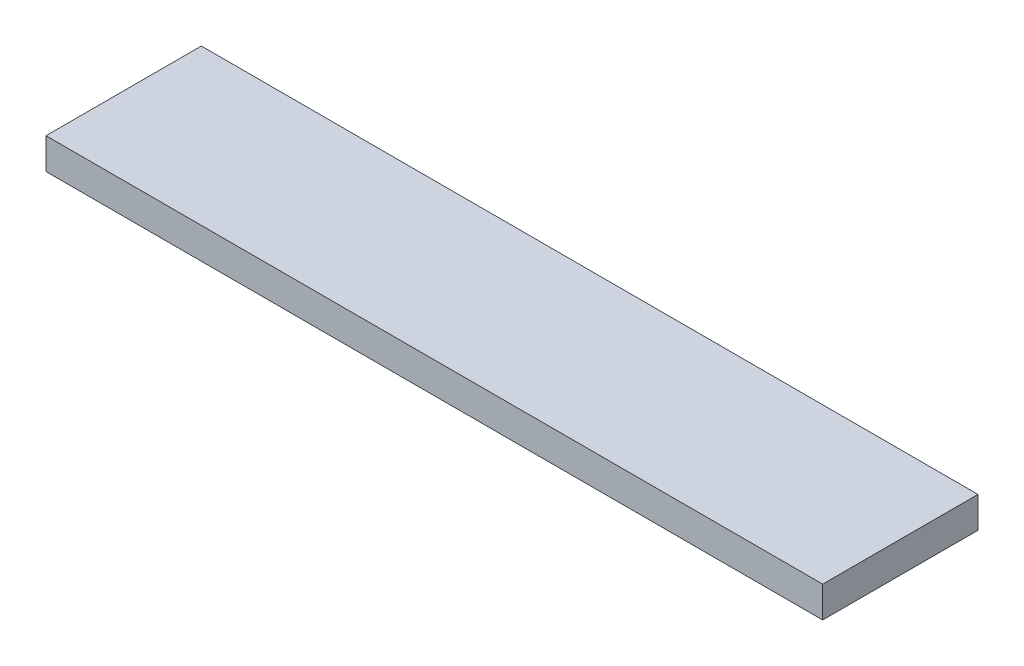
ISO-10303-21;
HEADER;
FILE_DESCRIPTION(('STEP AP214'),'2;1');
FILE_NAME('part.step','',(''),(''),'','','');
FILE_SCHEMA(('AUTOMOTIVE_DESIGN { 1 0 10303 214 1 1 1 1 }'));
ENDSEC;
DATA;
#1=APPLICATION_CONTEXT('core data for automotive mechanical design processes');
#2=APPLICATION_PROTOCOL_DEFINITION('international standard','automotive_design',2000,#1);
#3=PRODUCT_CONTEXT('',#1,'mechanical');
#4=PRODUCT('Part','Part','',(#3));
#5=PRODUCT_RELATED_PRODUCT_CATEGORY('part','',(#4));
#6=PRODUCT_DEFINITION_FORMATION('','',#4);
#7=PRODUCT_DEFINITION_CONTEXT('part definition',#1,'design');
#8=PRODUCT_DEFINITION('design','',#6,#7);
#9=PRODUCT_DEFINITION_SHAPE('','',#8);
#10=(LENGTH_UNIT() NAMED_UNIT(*) SI_UNIT(.MILLI.,.METRE.));
#11=(NAMED_UNIT(*) PLANE_ANGLE_UNIT() SI_UNIT($,.RADIAN.));
#12=(NAMED_UNIT(*) SI_UNIT($,.STERADIAN.) SOLID_ANGLE_UNIT());
#13=UNCERTAINTY_MEASURE_WITH_UNIT(LENGTH_MEASURE(1.E-05),#10,'distance_accuracy_value','');
#14=(GEOMETRIC_REPRESENTATION_CONTEXT(3) GLOBAL_UNCERTAINTY_ASSIGNED_CONTEXT((#13)) GLOBAL_UNIT_ASSIGNED_CONTEXT((#10,
#11,#12)) REPRESENTATION_CONTEXT('',''));
#15=CARTESIAN_POINT('',(0.,0.,0.));
#16=DIRECTION('',(0.,0.,1.));
#17=DIRECTION('',(1.,0.,0.));
#18=AXIS2_PLACEMENT_3D('',#15,#16,#17);
#19=CARTESIAN_POINT('',(75.,6.,-15.));
#20=DIRECTION('',(-1.,0.,0.));
#21=DIRECTION('',(0.,0.,1.));
#22=AXIS2_PLACEMENT_3D('',#19,#20,#21);
#23=PLANE('',#22);
#24=DIRECTION('',(0.,0.,-1.));
#25=VECTOR('',#24,1.);
#26=CARTESIAN_POINT('',(75.,0.,-15.));
#27=LINE('',#26,#25);
#28=CARTESIAN_POINT('',(75.,0.,15.));
#29=VERTEX_POINT('',#28);
#30=CARTESIAN_POINT('',(75.,0.,-15.));
#31=VERTEX_POINT('',#30);
#32=EDGE_CURVE('E107',#29,#31,#27,.T.);
#33=ORIENTED_EDGE('',*,*,#32,.T.);
#34=DIRECTION('',(0.,-1.,0.));
#35=VECTOR('',#34,1.);
#36=CARTESIAN_POINT('',(75.,6.,-15.));
#37=LINE('',#36,#35);
#38=CARTESIAN_POINT('',(75.,6.,-15.));
#39=VERTEX_POINT('',#38);
#40=EDGE_CURVE('E11',#39,#31,#37,.T.);
#41=ORIENTED_EDGE('',*,*,#40,.F.);
#42=DIRECTION('',(0.,0.,-1.));
#43=VECTOR('',#42,1.);
#44=CARTESIAN_POINT('',(75.,6.,-15.));
#45=LINE('',#44,#43);
#46=CARTESIAN_POINT('',(75.,6.,15.));
#47=VERTEX_POINT('',#46);
#48=EDGE_CURVE('E91',#47,#39,#45,.T.);
#49=ORIENTED_EDGE('',*,*,#48,.F.);
#50=DIRECTION('',(0.,-1.,0.));
#51=VECTOR('',#50,1.);
#52=CARTESIAN_POINT('',(75.,6.,15.));
#53=LINE('',#52,#51);
#54=EDGE_CURVE('E103',#47,#29,#53,.T.);
#55=ORIENTED_EDGE('',*,*,#54,.T.);
#56=EDGE_LOOP('',(#33,#41,#49,#55));
#57=FACE_BOUND('',#56,.T.);
#58=ADVANCED_FACE('F39',(#57),#23,.F.);
#59=CARTESIAN_POINT('',(-75.,6.,-15.));
#60=DIRECTION('',(0.,0.,1.));
#61=DIRECTION('',(1.,0.,0.));
#62=AXIS2_PLACEMENT_3D('',#59,#60,#61);
#63=PLANE('',#62);
#64=DIRECTION('',(-1.,0.,0.));
#65=VECTOR('',#64,1.);
#66=CARTESIAN_POINT('',(-75.,0.,-15.));
#67=LINE('',#66,#65);
#68=CARTESIAN_POINT('',(-75.,0.,-15.));
#69=VERTEX_POINT('',#68);
#70=EDGE_CURVE('E96',#31,#69,#67,.T.);
#71=ORIENTED_EDGE('',*,*,#70,.T.);
#72=DIRECTION('',(0.,-1.,0.));
#73=VECTOR('',#72,1.);
#74=CARTESIAN_POINT('',(-75.,6.,-15.));
#75=LINE('',#74,#73);
#76=CARTESIAN_POINT('',(-75.,6.,-15.));
#77=VERTEX_POINT('',#76);
#78=EDGE_CURVE('E48',#77,#69,#75,.T.);
#79=ORIENTED_EDGE('',*,*,#78,.F.);
#80=DIRECTION('',(-1.,0.,0.));
#81=VECTOR('',#80,1.);
#82=CARTESIAN_POINT('',(-75.,6.,-15.));
#83=LINE('',#82,#81);
#84=EDGE_CURVE('E86',#39,#77,#83,.T.);
#85=ORIENTED_EDGE('',*,*,#84,.F.);
#86=ORIENTED_EDGE('',*,*,#40,.T.);
#87=EDGE_LOOP('',(#71,#79,#85,#86));
#88=FACE_BOUND('',#87,.T.);
#89=ADVANCED_FACE('F95',(#88),#63,.F.);
#90=CARTESIAN_POINT('',(-75.,6.,-15.));
#91=DIRECTION('',(1.,0.,0.));
#92=DIRECTION('',(0.,0.,-1.));
#93=AXIS2_PLACEMENT_3D('',#90,#91,#92);
#94=PLANE('',#93);
#95=DIRECTION('',(0.,0.,1.));
#96=VECTOR('',#95,1.);
#97=CARTESIAN_POINT('',(-75.,0.,-15.));
#98=LINE('',#97,#96);
#99=CARTESIAN_POINT('',(-75.,0.,15.));
#100=VERTEX_POINT('',#99);
#101=EDGE_CURVE('E73',#69,#100,#98,.T.);
#102=ORIENTED_EDGE('',*,*,#101,.T.);
#103=DIRECTION('',(0.,-1.,0.));
#104=VECTOR('',#103,1.);
#105=CARTESIAN_POINT('',(-75.,6.,15.));
#106=LINE('',#105,#104);
#107=CARTESIAN_POINT('',(-75.,6.,15.));
#108=VERTEX_POINT('',#107);
#109=EDGE_CURVE('E98',#108,#100,#106,.T.);
#110=ORIENTED_EDGE('',*,*,#109,.F.);
#111=DIRECTION('',(0.,0.,1.));
#112=VECTOR('',#111,1.);
#113=CARTESIAN_POINT('',(-75.,6.,-15.));
#114=LINE('',#113,#112);
#115=EDGE_CURVE('E89',#77,#108,#114,.T.);
#116=ORIENTED_EDGE('',*,*,#115,.F.);
#117=ORIENTED_EDGE('',*,*,#78,.T.);
#118=EDGE_LOOP('',(#102,#110,#116,#117));
#119=FACE_BOUND('',#118,.T.);
#120=ADVANCED_FACE('F99',(#119),#94,.F.);
#121=CARTESIAN_POINT('',(-75.,6.,15.));
#122=DIRECTION('',(0.,0.,-1.));
#123=DIRECTION('',(-1.,0.,0.));
#124=AXIS2_PLACEMENT_3D('',#121,#122,#123);
#125=PLANE('',#124);
#126=DIRECTION('',(1.,0.,0.));
#127=VECTOR('',#126,1.);
#128=CARTESIAN_POINT('',(-75.,0.,15.));
#129=LINE('',#128,#127);
#130=EDGE_CURVE('E79',#100,#29,#129,.T.);
#131=ORIENTED_EDGE('',*,*,#130,.T.);
#132=ORIENTED_EDGE('',*,*,#54,.F.);
#133=DIRECTION('',(1.,0.,0.));
#134=VECTOR('',#133,1.);
#135=CARTESIAN_POINT('',(-75.,6.,15.));
#136=LINE('',#135,#134);
#137=EDGE_CURVE('E56',#108,#47,#136,.T.);
#138=ORIENTED_EDGE('',*,*,#137,.F.);
#139=ORIENTED_EDGE('',*,*,#109,.T.);
#140=EDGE_LOOP('',(#131,#132,#138,#139));
#141=FACE_BOUND('',#140,.T.);
#142=ADVANCED_FACE('F120',(#141),#125,.F.);
#143=CARTESIAN_POINT('',(0.,6.,0.));
#144=DIRECTION('',(0.,1.,0.));
#145=DIRECTION('',(0.,0.,1.));
#146=AXIS2_PLACEMENT_3D('',#143,#144,#145);
#147=PLANE('',#146);
#148=ORIENTED_EDGE('',*,*,#48,.T.);
#149=ORIENTED_EDGE('',*,*,#84,.T.);
#150=ORIENTED_EDGE('',*,*,#115,.T.);
#151=ORIENTED_EDGE('',*,*,#137,.T.);
#152=EDGE_LOOP('',(#148,#149,#150,#151));
#153=FACE_BOUND('',#152,.T.);
#154=ADVANCED_FACE('F87',(#153),#147,.T.);
#155=CARTESIAN_POINT('',(0.,0.,0.));
#156=DIRECTION('',(0.,1.,0.));
#157=DIRECTION('',(0.,0.,1.));
#158=AXIS2_PLACEMENT_3D('',#155,#156,#157);
#159=PLANE('',#158);
#160=ORIENTED_EDGE('',*,*,#32,.F.);
#161=ORIENTED_EDGE('',*,*,#130,.F.);
#162=ORIENTED_EDGE('',*,*,#101,.F.);
#163=ORIENTED_EDGE('',*,*,#70,.F.);
#164=EDGE_LOOP('',(#160,#161,#162,#163));
#165=FACE_BOUND('',#164,.T.);
#166=ADVANCED_FACE('F123',(#165),#159,.F.);
#167=CLOSED_SHELL('',(#58,#89,#120,#142,#154,#166));
#168=MANIFOLD_SOLID_BREP('B2',#167);
#169=ADVANCED_BREP_SHAPE_REPRESENTATION('',(#18,#168),#14);
#170=SHAPE_DEFINITION_REPRESENTATION(#9,#169);
ENDSEC;
END-ISO-10303-21;
